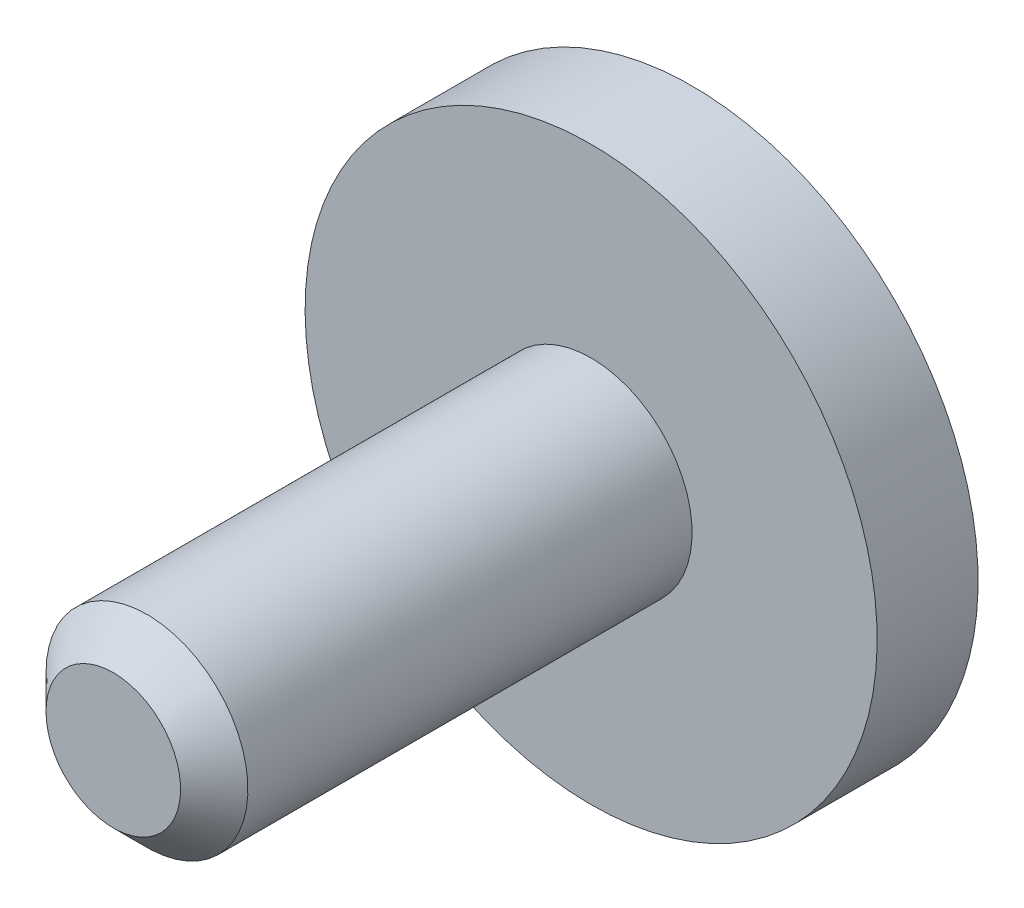
ISO-10303-21;
HEADER;
FILE_DESCRIPTION(('STEP AP214'),'2;1');
FILE_NAME('part.step','',(''),(''),'','','');
FILE_SCHEMA(('AUTOMOTIVE_DESIGN { 1 0 10303 214 1 1 1 1 }'));
ENDSEC;
DATA;
#1=APPLICATION_CONTEXT('core data for automotive mechanical design processes');
#2=APPLICATION_PROTOCOL_DEFINITION('international standard','automotive_design',2000,#1);
#3=PRODUCT_CONTEXT('',#1,'mechanical');
#4=PRODUCT('Part','Part','',(#3));
#5=PRODUCT_RELATED_PRODUCT_CATEGORY('part','',(#4));
#6=PRODUCT_DEFINITION_FORMATION('','',#4);
#7=PRODUCT_DEFINITION_CONTEXT('part definition',#1,'design');
#8=PRODUCT_DEFINITION('design','',#6,#7);
#9=PRODUCT_DEFINITION_SHAPE('','',#8);
#10=(LENGTH_UNIT() NAMED_UNIT(*) SI_UNIT(.MILLI.,.METRE.));
#11=(NAMED_UNIT(*) PLANE_ANGLE_UNIT() SI_UNIT($,.RADIAN.));
#12=(NAMED_UNIT(*) SI_UNIT($,.STERADIAN.) SOLID_ANGLE_UNIT());
#13=UNCERTAINTY_MEASURE_WITH_UNIT(LENGTH_MEASURE(1.E-05),#10,'distance_accuracy_value','');
#14=(GEOMETRIC_REPRESENTATION_CONTEXT(3) GLOBAL_UNCERTAINTY_ASSIGNED_CONTEXT((#13)) GLOBAL_UNIT_ASSIGNED_CONTEXT((#10,
#11,#12)) REPRESENTATION_CONTEXT('',''));
#15=CARTESIAN_POINT('',(0.,0.,0.));
#16=DIRECTION('',(0.,0.,1.));
#17=DIRECTION('',(1.,0.,0.));
#18=AXIS2_PLACEMENT_3D('',#15,#16,#17);
#19=CARTESIAN_POINT('',(69.9596903297769,-140.254270568155,363.174757541019));
#20=DIRECTION('',(0.,0.,-1.));
#21=DIRECTION('',(0.984807753012208,-0.173648177666931,0.));
#22=AXIS2_PLACEMENT_3D('',#19,#20,#21);
#23=CONICAL_SURFACE('',#22,1.,0.7853981625);
#24=CARTESIAN_POINT('',(69.9596903297769,-140.254270568155,363.174757541019));
#25=DIRECTION('',(0.,0.,-1.));
#26=DIRECTION('',(0.984807753012207,-0.173648177666934,0.));
#27=AXIS2_PLACEMENT_3D('',#24,#25,#26);
#28=CIRCLE('',#27,1.);
#29=CARTESIAN_POINT('',(70.9444980827891,-140.427918745822,363.174757541019));
#30=VERTEX_POINT('',#29);
#31=EDGE_CURVE('E52',#30,#30,#28,.T.);
#32=ORIENTED_EDGE('',*,*,#31,.T.);
#33=EDGE_LOOP('',(#32));
#34=FACE_BOUND('',#33,.T.);
#35=CARTESIAN_POINT('',(69.9596903297769,-140.254270568155,362.674757541018));
#36=DIRECTION('',(0.,0.,1.));
#37=DIRECTION('',(0.984807753012209,-0.173648177666926,0.));
#38=AXIS2_PLACEMENT_3D('',#35,#36,#37);
#39=CIRCLE('',#38,1.5);
#40=CARTESIAN_POINT('',(71.4369019592952,-140.514742834656,362.674757541018));
#41=VERTEX_POINT('',#40);
#42=EDGE_CURVE('E11',#41,#41,#39,.T.);
#43=ORIENTED_EDGE('',*,*,#42,.T.);
#44=EDGE_LOOP('',(#43));
#45=FACE_BOUND('',#44,.T.);
#46=ADVANCED_FACE('F42',(#34,#45),#23,.T.);
#47=CARTESIAN_POINT('',(69.9596903297769,-140.254270568155,356.374757541018));
#48=DIRECTION('',(0.,0.,1.));
#49=DIRECTION('',(0.173648177666936,0.984807753012207,0.));
#50=AXIS2_PLACEMENT_3D('',#47,#48,#49);
#51=CYLINDRICAL_SURFACE('',#50,1.5);
#52=CARTESIAN_POINT('',(69.9596903297769,-140.254270568155,356.074757541019));
#53=DIRECTION('',(0.,0.,1.));
#54=DIRECTION('',(0.984807753012209,-0.173648177666926,0.));
#55=AXIS2_PLACEMENT_3D('',#52,#53,#54);
#56=CIRCLE('',#55,1.5);
#57=CARTESIAN_POINT('',(71.4369019592952,-140.514742834656,356.074757541019));
#58=VERTEX_POINT('',#57);
#59=EDGE_CURVE('E136',#58,#58,#56,.T.);
#60=ORIENTED_EDGE('',*,*,#59,.T.);
#61=EDGE_LOOP('',(#60));
#62=FACE_BOUND('',#61,.T.);
#63=ORIENTED_EDGE('',*,*,#42,.F.);
#64=EDGE_LOOP('',(#63));
#65=FACE_BOUND('',#64,.T.);
#66=ADVANCED_FACE('F137',(#62,#65),#51,.T.);
#67=CARTESIAN_POINT('',(69.9596903297769,-140.254270568155,363.174757541019));
#68=DIRECTION('',(0.,0.,-1.));
#69=DIRECTION('',(0.,-1.,0.));
#70=AXIS2_PLACEMENT_3D('',#67,#68,#69);
#71=PLANE('',#70);
#72=ORIENTED_EDGE('',*,*,#31,.F.);
#73=EDGE_LOOP('',(#72));
#74=FACE_BOUND('',#73,.T.);
#75=ADVANCED_FACE('F233',(#74),#71,.F.);
#76=CARTESIAN_POINT('',(30.5073865712523,-234.42706774518,355.524757541019));
#77=DIRECTION('',(0.,0.,-1.));
#78=DIRECTION('',(0.,-1.,0.));
#79=AXIS2_PLACEMENT_3D('',#76,#77,#78);
#80=PLANE('',#79);
#81=DIRECTION('',(-0.342020143325667,0.939692620785909,0.));
#82=VECTOR('',#81,1.);
#83=CARTESIAN_POINT('',(94.2016621480234,-211.244247342087,355.524757541019));
#84=LINE('',#83,#82);
#85=CARTESIAN_POINT('',(68.8463495313244,-141.581098464493,355.524757541019));
#86=VERTEX_POINT('',#85);
#87=CARTESIAN_POINT('',(68.2539532658723,-139.953503101794,355.524757541019));
#88=VERTEX_POINT('',#87);
#89=EDGE_CURVE('E165',#86,#88,#84,.T.);
#90=ORIENTED_EDGE('',*,*,#89,.T.);
#91=DIRECTION('',(0.64278760968654,0.766044443118977,0.));
#92=VECTOR('',#91,1.);
#93=CARTESIAN_POINT('',(6.13883172066096,-213.979422357726,355.524757541019));
#94=LINE('',#93,#92);
#95=CARTESIAN_POINT('',(69.3672940643251,-138.626675205456,355.524757541019));
#96=VERTEX_POINT('',#95);
#97=EDGE_CURVE('E186',#88,#96,#94,.T.);
#98=ORIENTED_EDGE('',*,*,#97,.T.);
#99=DIRECTION('',(0.984807753012208,-0.173648177666931,0.));
#100=VECTOR('',#99,1.);
#101=CARTESIAN_POINT('',(48.0619881535029,-134.869974941131,355.524757541019));
#102=LINE('',#101,#100);
#103=CARTESIAN_POINT('',(71.0730311282301,-138.927442671817,355.524757541019));
#104=VERTEX_POINT('',#103);
#105=EDGE_CURVE('E171',#96,#104,#102,.T.);
#106=ORIENTED_EDGE('',*,*,#105,.T.);
#107=DIRECTION('',(0.342020143325666,-0.939692620785909,0.));
#108=VECTOR('',#107,1.);
#109=CARTESIAN_POINT('',(97.020740010381,-210.21818691211,355.524757541019));
#110=LINE('',#109,#108);
#111=CARTESIAN_POINT('',(71.6654273936822,-140.555038034516,355.524757541019));
#112=VERTEX_POINT('',#111);
#113=EDGE_CURVE('E182',#104,#112,#110,.T.);
#114=ORIENTED_EDGE('',*,*,#113,.T.);
#115=DIRECTION('',(-0.64278760968654,-0.766044443118978,0.));
#116=VECTOR('',#115,1.);
#117=CARTESIAN_POINT('',(8.43696505001801,-215.907785186786,355.524757541019));
#118=LINE('',#117,#116);
#119=CARTESIAN_POINT('',(70.5520865952292,-141.881865930854,355.524757541019));
#120=VERTEX_POINT('',#119);
#121=EDGE_CURVE('E153',#112,#120,#118,.T.);
#122=ORIENTED_EDGE('',*,*,#121,.T.);
#123=DIRECTION('',(-0.984807753012208,0.173648177666931,0.));
#124=VECTOR('',#123,1.);
#125=CARTESIAN_POINT('',(47.5410436205021,-137.824398200167,355.524757541019));
#126=LINE('',#125,#124);
#127=EDGE_CURVE('E176',#120,#86,#126,.T.);
#128=ORIENTED_EDGE('',*,*,#127,.T.);
#129=EDGE_LOOP('',(#90,#98,#106,#114,#122,#128));
#130=FACE_BOUND('',#129,.T.);
#131=ADVANCED_FACE('F235',(#130),#80,.T.);
#132=CARTESIAN_POINT('',(69.2745156644542,-138.737244196818,355.274757541019));
#133=DIRECTION('',(-0.766044443118977,0.64278760968654,0.));
#134=DIRECTION('',(0.,0.,1.));
#135=AXIS2_PLACEMENT_3D('',#132,#133,#134);
#136=PLANE('',#135);
#137=DIRECTION('',(-0.642787609686541,-0.766044443118977,0.));
#138=VECTOR('',#137,1.);
#139=CARTESIAN_POINT('',(68.8106236650986,-139.290089153625,354.574757541019));
#140=LINE('',#139,#138);
#141=CARTESIAN_POINT('',(69.3672940643251,-138.626675205456,354.574757541019));
#142=VERTEX_POINT('',#141);
#143=CARTESIAN_POINT('',(68.2539532658723,-139.953503101794,354.574757541019));
#144=VERTEX_POINT('',#143);
#145=EDGE_CURVE('E166',#142,#144,#140,.T.);
#146=ORIENTED_EDGE('',*,*,#145,.F.);
#147=DIRECTION('',(0.,0.,1.));
#148=VECTOR('',#147,1.);
#149=CARTESIAN_POINT('',(69.3672940643251,-138.626675205456,355.274757541019));
#150=LINE('',#149,#148);
#151=EDGE_CURVE('E174',#142,#96,#150,.T.);
#152=ORIENTED_EDGE('',*,*,#151,.T.);
#153=ORIENTED_EDGE('',*,*,#97,.F.);
#154=DIRECTION('',(0.,0.,1.));
#155=VECTOR('',#154,1.);
#156=CARTESIAN_POINT('',(68.2539532658723,-139.953503101794,355.274757541019));
#157=LINE('',#156,#155);
#158=EDGE_CURVE('E161',#144,#88,#157,.T.);
#159=ORIENTED_EDGE('',*,*,#158,.F.);
#160=EDGE_LOOP('',(#146,#152,#153,#159));
#161=FACE_BOUND('',#160,.T.);
#162=ADVANCED_FACE('F238',(#161),#136,.F.);
#163=CARTESIAN_POINT('',(70.9308863729046,-138.902378716287,355.274757541019));
#164=DIRECTION('',(0.173648177666931,0.984807753012208,0.));
#165=DIRECTION('',(0.,0.,-1.));
#166=AXIS2_PLACEMENT_3D('',#163,#164,#165);
#167=PLANE('',#166);
#168=DIRECTION('',(-0.984807753012208,0.173648177666931,0.));
#169=VECTOR('',#168,1.);
#170=CARTESIAN_POINT('',(70.2201625962773,-138.777058938637,354.574757541019));
#171=LINE('',#170,#169);
#172=CARTESIAN_POINT('',(71.0730311282301,-138.927442671817,354.574757541019));
#173=VERTEX_POINT('',#172);
#174=EDGE_CURVE('E158',#173,#142,#171,.T.);
#175=ORIENTED_EDGE('',*,*,#174,.F.);
#176=DIRECTION('',(0.,0.,1.));
#177=VECTOR('',#176,1.);
#178=CARTESIAN_POINT('',(71.0730311282301,-138.927442671817,355.274757541019));
#179=LINE('',#178,#177);
#180=EDGE_CURVE('E175',#173,#104,#179,.T.);
#181=ORIENTED_EDGE('',*,*,#180,.T.);
#182=ORIENTED_EDGE('',*,*,#105,.F.);
#183=ORIENTED_EDGE('',*,*,#151,.F.);
#184=EDGE_LOOP('',(#175,#181,#182,#183));
#185=FACE_BOUND('',#184,.T.);
#186=ADVANCED_FACE('F244',(#185),#167,.F.);
#187=CARTESIAN_POINT('',(71.6160610382277,-140.419405087624,355.274757541019));
#188=DIRECTION('',(0.939692620785909,0.342020143325666,0.));
#189=DIRECTION('',(0.,0.,-1.));
#190=AXIS2_PLACEMENT_3D('',#187,#188,#189);
#191=PLANE('',#190);
#192=DIRECTION('',(-0.342020143325667,0.939692620785909,0.));
#193=VECTOR('',#192,1.);
#194=CARTESIAN_POINT('',(71.369229260956,-139.741240353166,354.574757541019));
#195=LINE('',#194,#193);
#196=CARTESIAN_POINT('',(71.6654273936822,-140.555038034516,354.574757541019));
#197=VERTEX_POINT('',#196);
#198=EDGE_CURVE('E155',#197,#173,#195,.T.);
#199=ORIENTED_EDGE('',*,*,#198,.F.);
#200=DIRECTION('',(0.,0.,1.));
#201=VECTOR('',#200,1.);
#202=CARTESIAN_POINT('',(71.6654273936822,-140.555038034516,355.274757541019));
#203=LINE('',#202,#201);
#204=EDGE_CURVE('E89',#197,#112,#203,.T.);
#205=ORIENTED_EDGE('',*,*,#204,.T.);
#206=ORIENTED_EDGE('',*,*,#113,.F.);
#207=ORIENTED_EDGE('',*,*,#180,.F.);
#208=EDGE_LOOP('',(#199,#205,#206,#207));
#209=FACE_BOUND('',#208,.T.);
#210=ADVANCED_FACE('F247',(#209),#191,.F.);
#211=CARTESIAN_POINT('',(70.6448649951004,-141.771296939492,355.274757541019));
#212=DIRECTION('',(0.766044443118978,-0.64278760968654,0.));
#213=DIRECTION('',(0.,0.,-1.));
#214=AXIS2_PLACEMENT_3D('',#211,#212,#213);
#215=PLANE('',#214);
#216=DIRECTION('',(0.64278760968654,0.766044443118978,0.));
#217=VECTOR('',#216,1.);
#218=CARTESIAN_POINT('',(71.1087569944555,-141.218451982685,354.574757541019));
#219=LINE('',#218,#217);
#220=CARTESIAN_POINT('',(70.5520865952292,-141.881865930854,354.574757541019));
#221=VERTEX_POINT('',#220);
#222=EDGE_CURVE('E159',#221,#197,#219,.T.);
#223=ORIENTED_EDGE('',*,*,#222,.F.);
#224=DIRECTION('',(0.,0.,1.));
#225=VECTOR('',#224,1.);
#226=CARTESIAN_POINT('',(70.5520865952292,-141.881865930854,355.274757541019));
#227=LINE('',#226,#225);
#228=EDGE_CURVE('E46',#221,#120,#227,.T.);
#229=ORIENTED_EDGE('',*,*,#228,.T.);
#230=ORIENTED_EDGE('',*,*,#121,.F.);
#231=ORIENTED_EDGE('',*,*,#204,.F.);
#232=EDGE_LOOP('',(#223,#229,#230,#231));
#233=FACE_BOUND('',#232,.T.);
#234=ADVANCED_FACE('F249',(#233),#215,.F.);
#235=CARTESIAN_POINT('',(68.9884942866498,-141.606162420023,355.274757541019));
#236=DIRECTION('',(-0.173648177666931,-0.984807753012208,0.));
#237=DIRECTION('',(-0.984807753012208,0.173648177666931,0.));
#238=AXIS2_PLACEMENT_3D('',#235,#236,#237);
#239=PLANE('',#238);
#240=DIRECTION('',(0.984807753012208,-0.173648177666931,0.));
#241=VECTOR('',#240,1.);
#242=CARTESIAN_POINT('',(69.6992180632764,-141.731482197673,354.574757541019));
#243=LINE('',#242,#241);
#244=CARTESIAN_POINT('',(68.8463495313244,-141.581098464493,354.574757541019));
#245=VERTEX_POINT('',#244);
#246=EDGE_CURVE('E148',#245,#221,#243,.T.);
#247=ORIENTED_EDGE('',*,*,#246,.F.);
#248=DIRECTION('',(0.,0.,1.));
#249=VECTOR('',#248,1.);
#250=CARTESIAN_POINT('',(68.8463495313244,-141.581098464493,355.274757541019));
#251=LINE('',#250,#249);
#252=EDGE_CURVE('E170',#245,#86,#251,.T.);
#253=ORIENTED_EDGE('',*,*,#252,.T.);
#254=ORIENTED_EDGE('',*,*,#127,.F.);
#255=ORIENTED_EDGE('',*,*,#228,.F.);
#256=EDGE_LOOP('',(#247,#253,#254,#255));
#257=FACE_BOUND('',#256,.T.);
#258=ADVANCED_FACE('F242',(#257),#239,.F.);
#259=CARTESIAN_POINT('',(68.3033196213266,-140.089136048686,355.274757541019));
#260=DIRECTION('',(-0.939692620785909,-0.342020143325667,0.));
#261=DIRECTION('',(-0.342020143325667,0.939692620785909,0.));
#262=AXIS2_PLACEMENT_3D('',#259,#260,#261);
#263=PLANE('',#262);
#264=DIRECTION('',(0.342020143325667,-0.939692620785909,0.));
#265=VECTOR('',#264,1.);
#266=CARTESIAN_POINT('',(68.5501513985982,-140.767300783143,354.574757541019));
#267=LINE('',#266,#265);
#268=EDGE_CURVE('E141',#144,#245,#267,.T.);
#269=ORIENTED_EDGE('',*,*,#268,.F.);
#270=ORIENTED_EDGE('',*,*,#158,.T.);
#271=ORIENTED_EDGE('',*,*,#89,.F.);
#272=ORIENTED_EDGE('',*,*,#252,.F.);
#273=EDGE_LOOP('',(#269,#270,#271,#272));
#274=FACE_BOUND('',#273,.T.);
#275=ADVANCED_FACE('F225',(#274),#263,.F.);
#276=CARTESIAN_POINT('',(69.9596903297769,-140.254270568155,354.574757541019));
#277=DIRECTION('',(0.,0.,-1.));
#278=DIRECTION('',(0.,-1.,0.));
#279=AXIS2_PLACEMENT_3D('',#276,#277,#278);
#280=PLANE('',#279);
#281=ORIENTED_EDGE('',*,*,#268,.T.);
#282=ORIENTED_EDGE('',*,*,#246,.T.);
#283=ORIENTED_EDGE('',*,*,#222,.T.);
#284=ORIENTED_EDGE('',*,*,#198,.T.);
#285=ORIENTED_EDGE('',*,*,#174,.T.);
#286=ORIENTED_EDGE('',*,*,#145,.T.);
#287=EDGE_LOOP('',(#281,#282,#283,#284,#285,#286));
#288=FACE_BOUND('',#287,.T.);
#289=CARTESIAN_POINT('',(69.9596903297769,-140.254270568155,354.574757541019));
#290=DIRECTION('',(0.,0.,1.));
#291=DIRECTION('',(0.984807753012208,-0.17364817766693,0.));
#292=AXIS2_PLACEMENT_3D('',#289,#290,#291);
#293=CIRCLE('',#292,4.25);
#294=CARTESIAN_POINT('',(74.1451232800788,-140.99227532324,354.574757541019));
#295=VERTEX_POINT('',#294);
#296=EDGE_CURVE('E142',#295,#295,#293,.T.);
#297=ORIENTED_EDGE('',*,*,#296,.F.);
#298=EDGE_LOOP('',(#297));
#299=FACE_BOUND('',#298,.T.);
#300=ADVANCED_FACE('F218',(#288,#299),#280,.T.);
#301=CARTESIAN_POINT('',(69.9596903297769,-140.254270568155,356.074757541019));
#302=DIRECTION('',(0.,0.,-1.));
#303=DIRECTION('',(0.,-1.,0.));
#304=AXIS2_PLACEMENT_3D('',#301,#302,#303);
#305=PLANE('',#304);
#306=ORIENTED_EDGE('',*,*,#59,.F.);
#307=EDGE_LOOP('',(#306));
#308=FACE_BOUND('',#307,.T.);
#309=CARTESIAN_POINT('',(69.9596903297769,-140.254270568155,356.074757541019));
#310=DIRECTION('',(0.,0.,-1.));
#311=DIRECTION('',(0.984807753012208,-0.17364817766693,0.));
#312=AXIS2_PLACEMENT_3D('',#309,#310,#311);
#313=CIRCLE('',#312,4.25);
#314=CARTESIAN_POINT('',(74.1451232800788,-140.99227532324,356.074757541019));
#315=VERTEX_POINT('',#314);
#316=EDGE_CURVE('E150',#315,#315,#313,.T.);
#317=ORIENTED_EDGE('',*,*,#316,.F.);
#318=EDGE_LOOP('',(#317));
#319=FACE_BOUND('',#318,.T.);
#320=ADVANCED_FACE('F44',(#308,#319),#305,.F.);
#321=CARTESIAN_POINT('',(69.9596903297769,-140.254270568155,399.574757541019));
#322=DIRECTION('',(0.,0.,-1.));
#323=DIRECTION('',(0.17364817766693,0.984807753012208,0.));
#324=AXIS2_PLACEMENT_3D('',#321,#322,#323);
#325=CYLINDRICAL_SURFACE('',#324,4.25);
#326=ORIENTED_EDGE('',*,*,#296,.T.);
#327=EDGE_LOOP('',(#326));
#328=FACE_BOUND('',#327,.T.);
#329=ORIENTED_EDGE('',*,*,#316,.T.);
#330=EDGE_LOOP('',(#329));
#331=FACE_BOUND('',#330,.T.);
#332=ADVANCED_FACE('F215',(#328,#331),#325,.T.);
#333=CLOSED_SHELL('',(#46,#66,#75,#131,#162,#186,#210,#234,#258,#275,#300,#320,#332));
#334=MANIFOLD_SOLID_BREP('B2',#333);
#335=ADVANCED_BREP_SHAPE_REPRESENTATION('',(#18,#334),#14);
#336=SHAPE_DEFINITION_REPRESENTATION(#9,#335);
ENDSEC;
END-ISO-10303-21;
